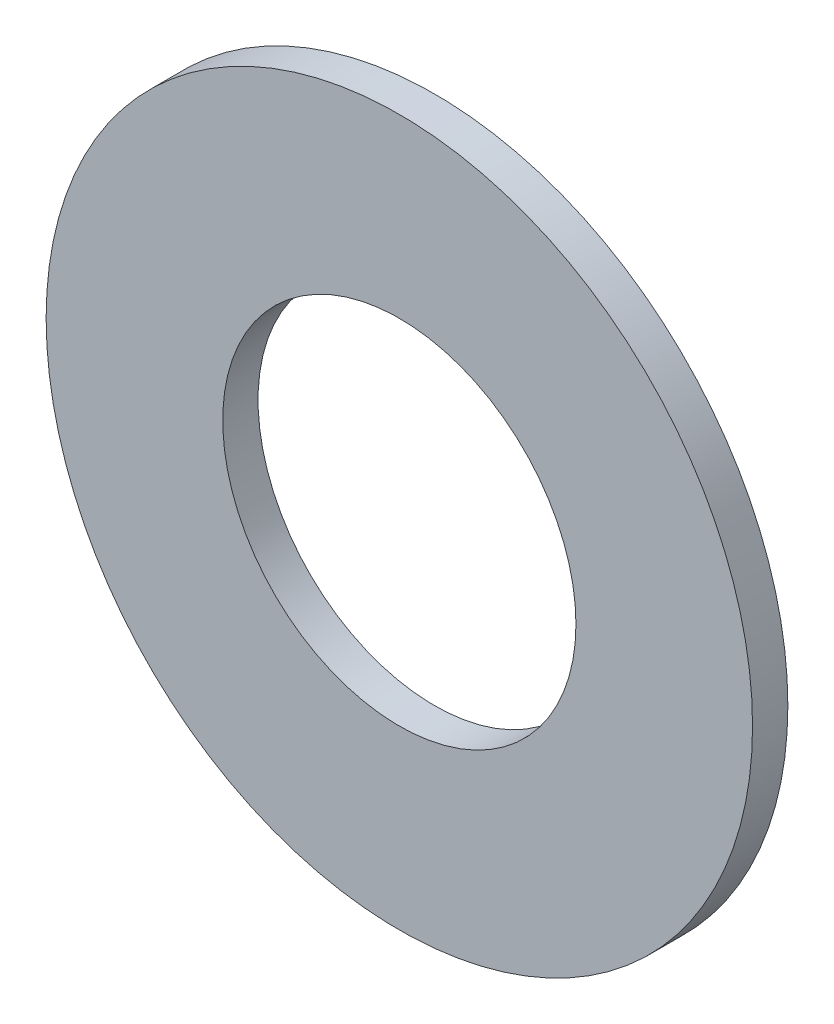
ISO-10303-21;
HEADER;
FILE_DESCRIPTION(('STEP AP214'),'2;1');
FILE_NAME('part.step','',(''),(''),'','','');
FILE_SCHEMA(('AUTOMOTIVE_DESIGN { 1 0 10303 214 1 1 1 1 }'));
ENDSEC;
DATA;
#1=APPLICATION_CONTEXT('core data for automotive mechanical design processes');
#2=APPLICATION_PROTOCOL_DEFINITION('international standard','automotive_design',2000,#1);
#3=PRODUCT_CONTEXT('',#1,'mechanical');
#4=PRODUCT('Part','Part','',(#3));
#5=PRODUCT_RELATED_PRODUCT_CATEGORY('part','',(#4));
#6=PRODUCT_DEFINITION_FORMATION('','',#4);
#7=PRODUCT_DEFINITION_CONTEXT('part definition',#1,'design');
#8=PRODUCT_DEFINITION('design','',#6,#7);
#9=PRODUCT_DEFINITION_SHAPE('','',#8);
#10=(LENGTH_UNIT() NAMED_UNIT(*) SI_UNIT(.MILLI.,.METRE.));
#11=(NAMED_UNIT(*) PLANE_ANGLE_UNIT() SI_UNIT($,.RADIAN.));
#12=(NAMED_UNIT(*) SI_UNIT($,.STERADIAN.) SOLID_ANGLE_UNIT());
#13=UNCERTAINTY_MEASURE_WITH_UNIT(LENGTH_MEASURE(1.E-05),#10,'distance_accuracy_value','');
#14=(GEOMETRIC_REPRESENTATION_CONTEXT(3) GLOBAL_UNCERTAINTY_ASSIGNED_CONTEXT((#13)) GLOBAL_UNIT_ASSIGNED_CONTEXT((#10,
#11,#12)) REPRESENTATION_CONTEXT('',''));
#15=CARTESIAN_POINT('',(0.,0.,0.));
#16=DIRECTION('',(0.,0.,1.));
#17=DIRECTION('',(1.,0.,0.));
#18=AXIS2_PLACEMENT_3D('',#15,#16,#17);
#19=CARTESIAN_POINT('',(0.,0.,1.));
#20=DIRECTION('',(0.,0.,1.));
#21=DIRECTION('',(1.,0.,0.));
#22=AXIS2_PLACEMENT_3D('',#19,#20,#21);
#23=PLANE('',#22);
#24=CARTESIAN_POINT('',(0.,0.,1.));
#25=DIRECTION('',(0.,0.,1.));
#26=DIRECTION('',(1.,0.,0.));
#27=AXIS2_PLACEMENT_3D('',#24,#25,#26);
#28=CIRCLE('',#27,10.);
#29=CARTESIAN_POINT('',(10.,0.,1.));
#30=VERTEX_POINT('',#29);
#31=EDGE_CURVE('E10',#30,#30,#28,.T.);
#32=ORIENTED_EDGE('',*,*,#31,.T.);
#33=EDGE_LOOP('',(#32));
#34=FACE_BOUND('',#33,.T.);
#35=CARTESIAN_POINT('',(0.,0.,1.));
#36=DIRECTION('',(0.,0.,1.));
#37=DIRECTION('',(1.,0.,0.));
#38=AXIS2_PLACEMENT_3D('',#35,#36,#37);
#39=CIRCLE('',#38,5.);
#40=CARTESIAN_POINT('',(5.,0.,1.));
#41=VERTEX_POINT('',#40);
#42=EDGE_CURVE('E46',#41,#41,#39,.T.);
#43=ORIENTED_EDGE('',*,*,#42,.F.);
#44=EDGE_LOOP('',(#43));
#45=FACE_BOUND('',#44,.T.);
#46=ADVANCED_FACE('F35',(#34,#45),#23,.T.);
#47=CARTESIAN_POINT('',(0.,0.,0.));
#48=DIRECTION('',(0.,0.,1.));
#49=DIRECTION('',(1.,0.,0.));
#50=AXIS2_PLACEMENT_3D('',#47,#48,#49);
#51=PLANE('',#50);
#52=CARTESIAN_POINT('',(0.,0.,0.));
#53=DIRECTION('',(0.,0.,1.));
#54=DIRECTION('',(1.,0.,0.));
#55=AXIS2_PLACEMENT_3D('',#52,#53,#54);
#56=CIRCLE('',#55,10.);
#57=CARTESIAN_POINT('',(10.,0.,0.));
#58=VERTEX_POINT('',#57);
#59=EDGE_CURVE('E39',#58,#58,#56,.T.);
#60=ORIENTED_EDGE('',*,*,#59,.F.);
#61=EDGE_LOOP('',(#60));
#62=FACE_BOUND('',#61,.T.);
#63=CARTESIAN_POINT('',(0.,0.,0.));
#64=DIRECTION('',(0.,0.,1.));
#65=DIRECTION('',(1.,0.,0.));
#66=AXIS2_PLACEMENT_3D('',#63,#64,#65);
#67=CIRCLE('',#66,5.);
#68=CARTESIAN_POINT('',(5.,0.,0.));
#69=VERTEX_POINT('',#68);
#70=EDGE_CURVE('E48',#69,#69,#67,.T.);
#71=ORIENTED_EDGE('',*,*,#70,.T.);
#72=EDGE_LOOP('',(#71));
#73=FACE_BOUND('',#72,.T.);
#74=ADVANCED_FACE('F58',(#62,#73),#51,.F.);
#75=CARTESIAN_POINT('',(0.,0.,1.));
#76=DIRECTION('',(0.,0.,-1.));
#77=DIRECTION('',(-1.,0.,0.));
#78=AXIS2_PLACEMENT_3D('',#75,#76,#77);
#79=CYLINDRICAL_SURFACE('',#78,10.);
#80=ORIENTED_EDGE('',*,*,#31,.F.);
#81=EDGE_LOOP('',(#80));
#82=FACE_BOUND('',#81,.T.);
#83=ORIENTED_EDGE('',*,*,#59,.T.);
#84=EDGE_LOOP('',(#83));
#85=FACE_BOUND('',#84,.T.);
#86=ADVANCED_FACE('F37',(#82,#85),#79,.T.);
#87=CARTESIAN_POINT('',(0.,0.,1.));
#88=DIRECTION('',(0.,0.,-1.));
#89=DIRECTION('',(-1.,0.,0.));
#90=AXIS2_PLACEMENT_3D('',#87,#88,#89);
#91=CYLINDRICAL_SURFACE('',#90,5.);
#92=ORIENTED_EDGE('',*,*,#42,.T.);
#93=EDGE_LOOP('',(#92));
#94=FACE_BOUND('',#93,.T.);
#95=ORIENTED_EDGE('',*,*,#70,.F.);
#96=EDGE_LOOP('',(#95));
#97=FACE_BOUND('',#96,.T.);
#98=ADVANCED_FACE('F54',(#94,#97),#91,.F.);
#99=CLOSED_SHELL('',(#46,#74,#86,#98));
#100=MANIFOLD_SOLID_BREP('B2',#99);
#101=ADVANCED_BREP_SHAPE_REPRESENTATION('',(#18,#100),#14);
#102=SHAPE_DEFINITION_REPRESENTATION(#9,#101);
ENDSEC;
END-ISO-10303-21;
